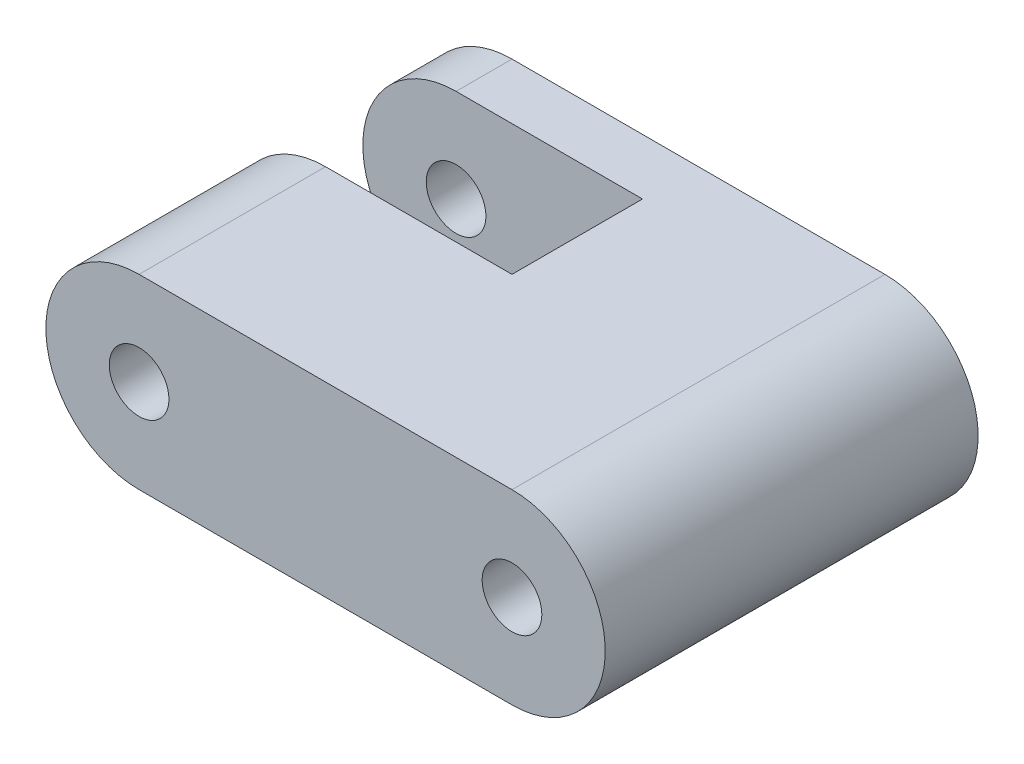
ISO-10303-21;
HEADER;
FILE_DESCRIPTION(('STEP AP214'),'2;1');
FILE_NAME('part.step','',(''),(''),'','','');
FILE_SCHEMA(('AUTOMOTIVE_DESIGN { 1 0 10303 214 1 1 1 1 }'));
ENDSEC;
DATA;
#1=APPLICATION_CONTEXT('core data for automotive mechanical design processes');
#2=APPLICATION_PROTOCOL_DEFINITION('international standard','automotive_design',2000,#1);
#3=PRODUCT_CONTEXT('',#1,'mechanical');
#4=PRODUCT('Part','Part','',(#3));
#5=PRODUCT_RELATED_PRODUCT_CATEGORY('part','',(#4));
#6=PRODUCT_DEFINITION_FORMATION('','',#4);
#7=PRODUCT_DEFINITION_CONTEXT('part definition',#1,'design');
#8=PRODUCT_DEFINITION('design','',#6,#7);
#9=PRODUCT_DEFINITION_SHAPE('','',#8);
#10=(LENGTH_UNIT() NAMED_UNIT(*) SI_UNIT(.MILLI.,.METRE.));
#11=(NAMED_UNIT(*) PLANE_ANGLE_UNIT() SI_UNIT($,.RADIAN.));
#12=(NAMED_UNIT(*) SI_UNIT($,.STERADIAN.) SOLID_ANGLE_UNIT());
#13=UNCERTAINTY_MEASURE_WITH_UNIT(LENGTH_MEASURE(1.E-05),#10,'distance_accuracy_value','');
#14=(GEOMETRIC_REPRESENTATION_CONTEXT(3) GLOBAL_UNCERTAINTY_ASSIGNED_CONTEXT((#13)) GLOBAL_UNIT_ASSIGNED_CONTEXT((#10,
#11,#12)) REPRESENTATION_CONTEXT('',''));
#15=CARTESIAN_POINT('',(0.,0.,0.));
#16=DIRECTION('',(0.,0.,1.));
#17=DIRECTION('',(1.,0.,0.));
#18=AXIS2_PLACEMENT_3D('',#15,#16,#17);
#19=CARTESIAN_POINT('',(-20.,0.,20.));
#20=DIRECTION('',(0.,0.,-1.));
#21=DIRECTION('',(-1.,0.,0.));
#22=AXIS2_PLACEMENT_3D('',#19,#20,#21);
#23=CYLINDRICAL_SURFACE('',#22,5.);
#24=CARTESIAN_POINT('',(-20.,0.,3.));
#25=DIRECTION('',(0.,0.,-1.));
#26=DIRECTION('',(-1.,0.,0.));
#27=AXIS2_PLACEMENT_3D('',#24,#25,#26);
#28=CIRCLE('',#27,5.);
#29=CARTESIAN_POINT('',(-20.,-5.,3.));
#30=VERTEX_POINT('',#29);
#31=CARTESIAN_POINT('',(-20.,5.,3.));
#32=VERTEX_POINT('',#31);
#33=EDGE_CURVE('E161',#30,#32,#28,.T.);
#34=ORIENTED_EDGE('',*,*,#33,.T.);
#35=DIRECTION('',(0.,0.,-1.));
#36=VECTOR('',#35,1.);
#37=CARTESIAN_POINT('',(-20.,5.,20.));
#38=LINE('',#37,#36);
#39=CARTESIAN_POINT('',(-20.,5.,0.));
#40=VERTEX_POINT('',#39);
#41=EDGE_CURVE('E94',#32,#40,#38,.T.);
#42=ORIENTED_EDGE('',*,*,#41,.T.);
#43=CARTESIAN_POINT('',(-20.,0.,0.));
#44=DIRECTION('',(0.,0.,1.));
#45=DIRECTION('',(1.,0.,0.));
#46=AXIS2_PLACEMENT_3D('',#43,#44,#45);
#47=CIRCLE('',#46,5.);
#48=CARTESIAN_POINT('',(-20.,-5.,0.));
#49=VERTEX_POINT('',#48);
#50=EDGE_CURVE('E177',#40,#49,#47,.T.);
#51=ORIENTED_EDGE('',*,*,#50,.T.);
#52=DIRECTION('',(0.,0.,-1.));
#53=VECTOR('',#52,1.);
#54=CARTESIAN_POINT('',(-20.,-5.,20.));
#55=LINE('',#54,#53);
#56=EDGE_CURVE('E55',#30,#49,#55,.T.);
#57=ORIENTED_EDGE('',*,*,#56,.F.);
#58=EDGE_LOOP('',(#34,#42,#51,#57));
#59=FACE_BOUND('',#58,.T.);
#60=ADVANCED_FACE('F45',(#59),#23,.T.);
#61=CARTESIAN_POINT('',(-20.,0.,20.));
#62=DIRECTION('',(0.,0.,-1.));
#63=DIRECTION('',(-1.,0.,0.));
#64=AXIS2_PLACEMENT_3D('',#61,#62,#63);
#65=CYLINDRICAL_SURFACE('',#64,1.6);
#66=CARTESIAN_POINT('',(-20.,0.,3.));
#67=DIRECTION('',(0.,0.,-1.));
#68=DIRECTION('',(-1.,0.,0.));
#69=AXIS2_PLACEMENT_3D('',#66,#67,#68);
#70=CIRCLE('',#69,1.6);
#71=CARTESIAN_POINT('',(-21.6,0.,3.));
#72=VERTEX_POINT('',#71);
#73=EDGE_CURVE('E49',#72,#72,#70,.T.);
#74=ORIENTED_EDGE('',*,*,#73,.F.);
#75=EDGE_LOOP('',(#74));
#76=FACE_BOUND('',#75,.T.);
#77=CARTESIAN_POINT('',(-20.,0.,0.));
#78=DIRECTION('',(0.,0.,1.));
#79=DIRECTION('',(1.,0.,0.));
#80=AXIS2_PLACEMENT_3D('',#77,#78,#79);
#81=CIRCLE('',#80,1.6);
#82=CARTESIAN_POINT('',(-18.4,0.,0.));
#83=VERTEX_POINT('',#82);
#84=EDGE_CURVE('E169',#83,#83,#81,.T.);
#85=ORIENTED_EDGE('',*,*,#84,.F.);
#86=EDGE_LOOP('',(#85));
#87=FACE_BOUND('',#86,.T.);
#88=ADVANCED_FACE('F224',(#76,#87),#65,.F.);
#89=CARTESIAN_POINT('',(-20.,0.,20.));
#90=DIRECTION('',(0.,0.,1.));
#91=DIRECTION('',(1.,0.,0.));
#92=AXIS2_PLACEMENT_3D('',#89,#90,#91);
#93=PLANE('',#92);
#94=CARTESIAN_POINT('',(-20.,0.,20.));
#95=DIRECTION('',(0.,0.,1.));
#96=DIRECTION('',(1.,0.,0.));
#97=AXIS2_PLACEMENT_3D('',#94,#95,#96);
#98=CIRCLE('',#97,1.6);
#99=CARTESIAN_POINT('',(-18.4,0.,20.));
#100=VERTEX_POINT('',#99);
#101=EDGE_CURVE('E173',#100,#100,#98,.T.);
#102=ORIENTED_EDGE('',*,*,#101,.F.);
#103=EDGE_LOOP('',(#102));
#104=FACE_BOUND('',#103,.T.);
#105=CARTESIAN_POINT('',(-20.,0.,20.));
#106=DIRECTION('',(0.,0.,1.));
#107=DIRECTION('',(1.,0.,0.));
#108=AXIS2_PLACEMENT_3D('',#105,#106,#107);
#109=CIRCLE('',#108,5.);
#110=CARTESIAN_POINT('',(-20.,5.,20.));
#111=VERTEX_POINT('',#110);
#112=CARTESIAN_POINT('',(-20.,-5.,20.));
#113=VERTEX_POINT('',#112);
#114=EDGE_CURVE('E181',#111,#113,#109,.T.);
#115=ORIENTED_EDGE('',*,*,#114,.T.);
#116=DIRECTION('',(1.,0.,0.));
#117=VECTOR('',#116,1.);
#118=CARTESIAN_POINT('',(-20.,-5.,20.));
#119=LINE('',#118,#117);
#120=CARTESIAN_POINT('',(0.,-5.,20.));
#121=VERTEX_POINT('',#120);
#122=EDGE_CURVE('E101',#113,#121,#119,.T.);
#123=ORIENTED_EDGE('',*,*,#122,.T.);
#124=CARTESIAN_POINT('',(0.,0.,20.));
#125=DIRECTION('',(0.,0.,1.));
#126=DIRECTION('',(1.,0.,0.));
#127=AXIS2_PLACEMENT_3D('',#124,#125,#126);
#128=CIRCLE('',#127,5.);
#129=CARTESIAN_POINT('',(0.,5.,20.));
#130=VERTEX_POINT('',#129);
#131=EDGE_CURVE('E187',#121,#130,#128,.T.);
#132=ORIENTED_EDGE('',*,*,#131,.T.);
#133=DIRECTION('',(-1.,0.,0.));
#134=VECTOR('',#133,1.);
#135=CARTESIAN_POINT('',(-20.,5.,20.));
#136=LINE('',#135,#134);
#137=EDGE_CURVE('E72',#130,#111,#136,.T.);
#138=ORIENTED_EDGE('',*,*,#137,.T.);
#139=EDGE_LOOP('',(#115,#123,#132,#138));
#140=FACE_BOUND('',#139,.T.);
#141=CARTESIAN_POINT('',(0.,0.,20.));
#142=DIRECTION('',(0.,0.,1.));
#143=DIRECTION('',(1.,0.,0.));
#144=AXIS2_PLACEMENT_3D('',#141,#142,#143);
#145=CIRCLE('',#144,1.6);
#146=CARTESIAN_POINT('',(1.6,0.,20.));
#147=VERTEX_POINT('',#146);
#148=EDGE_CURVE('E165',#147,#147,#145,.T.);
#149=ORIENTED_EDGE('',*,*,#148,.F.);
#150=EDGE_LOOP('',(#149));
#151=FACE_BOUND('',#150,.T.);
#152=ADVANCED_FACE('F227',(#104,#140,#151),#93,.T.);
#153=CARTESIAN_POINT('',(-20.,0.,0.));
#154=DIRECTION('',(0.,0.,1.));
#155=DIRECTION('',(1.,0.,0.));
#156=AXIS2_PLACEMENT_3D('',#153,#154,#155);
#157=PLANE('',#156);
#158=ORIENTED_EDGE('',*,*,#50,.F.);
#159=DIRECTION('',(-1.,0.,0.));
#160=VECTOR('',#159,1.);
#161=CARTESIAN_POINT('',(-20.,5.,0.));
#162=LINE('',#161,#160);
#163=CARTESIAN_POINT('',(0.,5.,0.));
#164=VERTEX_POINT('',#163);
#165=EDGE_CURVE('E184',#164,#40,#162,.T.);
#166=ORIENTED_EDGE('',*,*,#165,.F.);
#167=CARTESIAN_POINT('',(0.,0.,0.));
#168=DIRECTION('',(0.,0.,1.));
#169=DIRECTION('',(1.,0.,0.));
#170=AXIS2_PLACEMENT_3D('',#167,#168,#169);
#171=CIRCLE('',#170,5.);
#172=CARTESIAN_POINT('',(0.,-5.,0.));
#173=VERTEX_POINT('',#172);
#174=EDGE_CURVE('E197',#173,#164,#171,.T.);
#175=ORIENTED_EDGE('',*,*,#174,.F.);
#176=DIRECTION('',(1.,0.,0.));
#177=VECTOR('',#176,1.);
#178=CARTESIAN_POINT('',(-20.,-5.,0.));
#179=LINE('',#178,#177);
#180=EDGE_CURVE('E194',#49,#173,#179,.T.);
#181=ORIENTED_EDGE('',*,*,#180,.F.);
#182=EDGE_LOOP('',(#158,#166,#175,#181));
#183=FACE_BOUND('',#182,.T.);
#184=ORIENTED_EDGE('',*,*,#84,.T.);
#185=EDGE_LOOP('',(#184));
#186=FACE_BOUND('',#185,.T.);
#187=CARTESIAN_POINT('',(0.,0.,0.));
#188=DIRECTION('',(0.,0.,1.));
#189=DIRECTION('',(1.,0.,0.));
#190=AXIS2_PLACEMENT_3D('',#187,#188,#189);
#191=CIRCLE('',#190,1.6);
#192=CARTESIAN_POINT('',(1.6,0.,0.));
#193=VERTEX_POINT('',#192);
#194=EDGE_CURVE('E164',#193,#193,#191,.T.);
#195=ORIENTED_EDGE('',*,*,#194,.T.);
#196=EDGE_LOOP('',(#195));
#197=FACE_BOUND('',#196,.T.);
#198=ADVANCED_FACE('F229',(#183,#186,#197),#157,.F.);
#199=CARTESIAN_POINT('',(-20.,5.,10.));
#200=VERTEX_POINT('',#199);
#201=EDGE_CURVE('E202',#111,#200,#38,.T.);
#202=ORIENTED_EDGE('',*,*,#201,.T.);
#203=CARTESIAN_POINT('',(-20.,0.,10.));
#204=DIRECTION('',(0.,0.,1.));
#205=DIRECTION('',(1.,0.,0.));
#206=AXIS2_PLACEMENT_3D('',#203,#204,#205);
#207=CIRCLE('',#206,5.);
#208=CARTESIAN_POINT('',(-20.,-5.,10.));
#209=VERTEX_POINT('',#208);
#210=EDGE_CURVE('E63',#200,#209,#207,.T.);
#211=ORIENTED_EDGE('',*,*,#210,.T.);
#212=EDGE_CURVE('E11',#113,#209,#55,.T.);
#213=ORIENTED_EDGE('',*,*,#212,.F.);
#214=ORIENTED_EDGE('',*,*,#114,.F.);
#215=EDGE_LOOP('',(#202,#211,#213,#214));
#216=FACE_BOUND('',#215,.T.);
#217=ADVANCED_FACE('F47',(#216),#23,.T.);
#218=CARTESIAN_POINT('',(-20.,-5.,20.));
#219=DIRECTION('',(0.,1.,0.));
#220=DIRECTION('',(-1.,0.,0.));
#221=AXIS2_PLACEMENT_3D('',#218,#219,#220);
#222=PLANE('',#221);
#223=DIRECTION('',(0.,0.,-1.));
#224=VECTOR('',#223,1.);
#225=CARTESIAN_POINT('',(-10.,-5.,3.));
#226=LINE('',#225,#224);
#227=CARTESIAN_POINT('',(-10.,-5.,10.));
#228=VERTEX_POINT('',#227);
#229=CARTESIAN_POINT('',(-10.,-5.,3.));
#230=VERTEX_POINT('',#229);
#231=EDGE_CURVE('E134',#228,#230,#226,.T.);
#232=ORIENTED_EDGE('',*,*,#231,.T.);
#233=DIRECTION('',(-1.,0.,0.));
#234=VECTOR('',#233,1.);
#235=CARTESIAN_POINT('',(-25.,-5.,3.));
#236=LINE('',#235,#234);
#237=EDGE_CURVE('E131',#230,#30,#236,.T.);
#238=ORIENTED_EDGE('',*,*,#237,.T.);
#239=ORIENTED_EDGE('',*,*,#56,.T.);
#240=ORIENTED_EDGE('',*,*,#180,.T.);
#241=DIRECTION('',(0.,0.,-1.));
#242=VECTOR('',#241,1.);
#243=CARTESIAN_POINT('',(0.,-5.,20.));
#244=LINE('',#243,#242);
#245=EDGE_CURVE('E210',#121,#173,#244,.T.);
#246=ORIENTED_EDGE('',*,*,#245,.F.);
#247=ORIENTED_EDGE('',*,*,#122,.F.);
#248=ORIENTED_EDGE('',*,*,#212,.T.);
#249=DIRECTION('',(1.,0.,0.));
#250=VECTOR('',#249,1.);
#251=CARTESIAN_POINT('',(-25.,-5.,10.));
#252=LINE('',#251,#250);
#253=EDGE_CURVE('E124',#209,#228,#252,.T.);
#254=ORIENTED_EDGE('',*,*,#253,.T.);
#255=EDGE_LOOP('',(#232,#238,#239,#240,#246,#247,#248,#254));
#256=FACE_BOUND('',#255,.T.);
#257=ADVANCED_FACE('F140',(#256),#222,.F.);
#258=CARTESIAN_POINT('',(0.,0.,20.));
#259=DIRECTION('',(0.,0.,-1.));
#260=DIRECTION('',(-1.,0.,0.));
#261=AXIS2_PLACEMENT_3D('',#258,#259,#260);
#262=CYLINDRICAL_SURFACE('',#261,5.);
#263=ORIENTED_EDGE('',*,*,#174,.T.);
#264=DIRECTION('',(0.,0.,-1.));
#265=VECTOR('',#264,1.);
#266=CARTESIAN_POINT('',(0.,5.,20.));
#267=LINE('',#266,#265);
#268=EDGE_CURVE('E206',#130,#164,#267,.T.);
#269=ORIENTED_EDGE('',*,*,#268,.F.);
#270=ORIENTED_EDGE('',*,*,#131,.F.);
#271=ORIENTED_EDGE('',*,*,#245,.T.);
#272=EDGE_LOOP('',(#263,#269,#270,#271));
#273=FACE_BOUND('',#272,.T.);
#274=ADVANCED_FACE('F319',(#273),#262,.T.);
#275=CARTESIAN_POINT('',(-20.,5.,20.));
#276=DIRECTION('',(0.,-1.,0.));
#277=DIRECTION('',(1.,0.,0.));
#278=AXIS2_PLACEMENT_3D('',#275,#276,#277);
#279=PLANE('',#278);
#280=ORIENTED_EDGE('',*,*,#41,.F.);
#281=DIRECTION('',(-1.,0.,0.));
#282=VECTOR('',#281,1.);
#283=CARTESIAN_POINT('',(-25.,5.,3.));
#284=LINE('',#283,#282);
#285=CARTESIAN_POINT('',(-10.,5.,3.));
#286=VERTEX_POINT('',#285);
#287=EDGE_CURVE('E143',#286,#32,#284,.T.);
#288=ORIENTED_EDGE('',*,*,#287,.F.);
#289=DIRECTION('',(0.,0.,-1.));
#290=VECTOR('',#289,1.);
#291=CARTESIAN_POINT('',(-10.,5.,3.));
#292=LINE('',#291,#290);
#293=CARTESIAN_POINT('',(-10.,5.,10.));
#294=VERTEX_POINT('',#293);
#295=EDGE_CURVE('E147',#294,#286,#292,.T.);
#296=ORIENTED_EDGE('',*,*,#295,.F.);
#297=DIRECTION('',(1.,0.,0.));
#298=VECTOR('',#297,1.);
#299=CARTESIAN_POINT('',(-25.,5.,10.));
#300=LINE('',#299,#298);
#301=EDGE_CURVE('E125',#200,#294,#300,.T.);
#302=ORIENTED_EDGE('',*,*,#301,.F.);
#303=ORIENTED_EDGE('',*,*,#201,.F.);
#304=ORIENTED_EDGE('',*,*,#137,.F.);
#305=ORIENTED_EDGE('',*,*,#268,.T.);
#306=ORIENTED_EDGE('',*,*,#165,.T.);
#307=EDGE_LOOP('',(#280,#288,#296,#302,#303,#304,#305,#306));
#308=FACE_BOUND('',#307,.T.);
#309=ADVANCED_FACE('F222',(#308),#279,.F.);
#310=CARTESIAN_POINT('',(-20.,0.,10.));
#311=DIRECTION('',(0.,0.,1.));
#312=DIRECTION('',(1.,0.,0.));
#313=AXIS2_PLACEMENT_3D('',#310,#311,#312);
#314=CIRCLE('',#313,1.6);
#315=CARTESIAN_POINT('',(-18.4,0.,10.));
#316=VERTEX_POINT('',#315);
#317=EDGE_CURVE('E157',#316,#316,#314,.T.);
#318=ORIENTED_EDGE('',*,*,#317,.F.);
#319=EDGE_LOOP('',(#318));
#320=FACE_BOUND('',#319,.T.);
#321=ORIENTED_EDGE('',*,*,#101,.T.);
#322=EDGE_LOOP('',(#321));
#323=FACE_BOUND('',#322,.T.);
#324=ADVANCED_FACE('F218',(#320,#323),#65,.F.);
#325=CARTESIAN_POINT('',(0.,0.,20.));
#326=DIRECTION('',(0.,0.,-1.));
#327=DIRECTION('',(-1.,0.,0.));
#328=AXIS2_PLACEMENT_3D('',#325,#326,#327);
#329=CYLINDRICAL_SURFACE('',#328,1.6);
#330=ORIENTED_EDGE('',*,*,#148,.T.);
#331=EDGE_LOOP('',(#330));
#332=FACE_BOUND('',#331,.T.);
#333=ORIENTED_EDGE('',*,*,#194,.F.);
#334=EDGE_LOOP('',(#333));
#335=FACE_BOUND('',#334,.T.);
#336=ADVANCED_FACE('F221',(#332,#335),#329,.F.);
#337=CARTESIAN_POINT('',(-25.,-5.,3.));
#338=DIRECTION('',(0.,0.,-1.));
#339=DIRECTION('',(-1.,0.,0.));
#340=AXIS2_PLACEMENT_3D('',#337,#338,#339);
#341=PLANE('',#340);
#342=ORIENTED_EDGE('',*,*,#73,.T.);
#343=EDGE_LOOP('',(#342));
#344=FACE_BOUND('',#343,.T.);
#345=ORIENTED_EDGE('',*,*,#33,.F.);
#346=ORIENTED_EDGE('',*,*,#237,.F.);
#347=DIRECTION('',(0.,1.,0.));
#348=VECTOR('',#347,1.);
#349=CARTESIAN_POINT('',(-10.,-5.,3.));
#350=LINE('',#349,#348);
#351=EDGE_CURVE('E130',#230,#286,#350,.T.);
#352=ORIENTED_EDGE('',*,*,#351,.T.);
#353=ORIENTED_EDGE('',*,*,#287,.T.);
#354=EDGE_LOOP('',(#345,#346,#352,#353));
#355=FACE_BOUND('',#354,.T.);
#356=ADVANCED_FACE('F237',(#344,#355),#341,.F.);
#357=CARTESIAN_POINT('',(-25.,-5.,10.));
#358=DIRECTION('',(0.,0.,1.));
#359=DIRECTION('',(1.,0.,0.));
#360=AXIS2_PLACEMENT_3D('',#357,#358,#359);
#361=PLANE('',#360);
#362=ORIENTED_EDGE('',*,*,#317,.T.);
#363=EDGE_LOOP('',(#362));
#364=FACE_BOUND('',#363,.T.);
#365=ORIENTED_EDGE('',*,*,#301,.T.);
#366=DIRECTION('',(0.,1.,0.));
#367=VECTOR('',#366,1.);
#368=CARTESIAN_POINT('',(-10.,-5.,10.));
#369=LINE('',#368,#367);
#370=EDGE_CURVE('E120',#228,#294,#369,.T.);
#371=ORIENTED_EDGE('',*,*,#370,.F.);
#372=ORIENTED_EDGE('',*,*,#253,.F.);
#373=ORIENTED_EDGE('',*,*,#210,.F.);
#374=EDGE_LOOP('',(#365,#371,#372,#373));
#375=FACE_BOUND('',#374,.T.);
#376=ADVANCED_FACE('F122',(#364,#375),#361,.F.);
#377=CARTESIAN_POINT('',(-10.,-5.,3.));
#378=DIRECTION('',(1.,0.,0.));
#379=DIRECTION('',(0.,0.,-1.));
#380=AXIS2_PLACEMENT_3D('',#377,#378,#379);
#381=PLANE('',#380);
#382=ORIENTED_EDGE('',*,*,#295,.T.);
#383=ORIENTED_EDGE('',*,*,#351,.F.);
#384=ORIENTED_EDGE('',*,*,#231,.F.);
#385=ORIENTED_EDGE('',*,*,#370,.T.);
#386=EDGE_LOOP('',(#382,#383,#384,#385));
#387=FACE_BOUND('',#386,.T.);
#388=ADVANCED_FACE('F135',(#387),#381,.F.);
#389=CLOSED_SHELL('',(#60,#88,#152,#198,#217,#257,#274,#309,#324,#336,#356,#376,#388));
#390=MANIFOLD_SOLID_BREP('B2',#389);
#391=ADVANCED_BREP_SHAPE_REPRESENTATION('',(#18,#390),#14);
#392=SHAPE_DEFINITION_REPRESENTATION(#9,#391);
ENDSEC;
END-ISO-10303-21;
